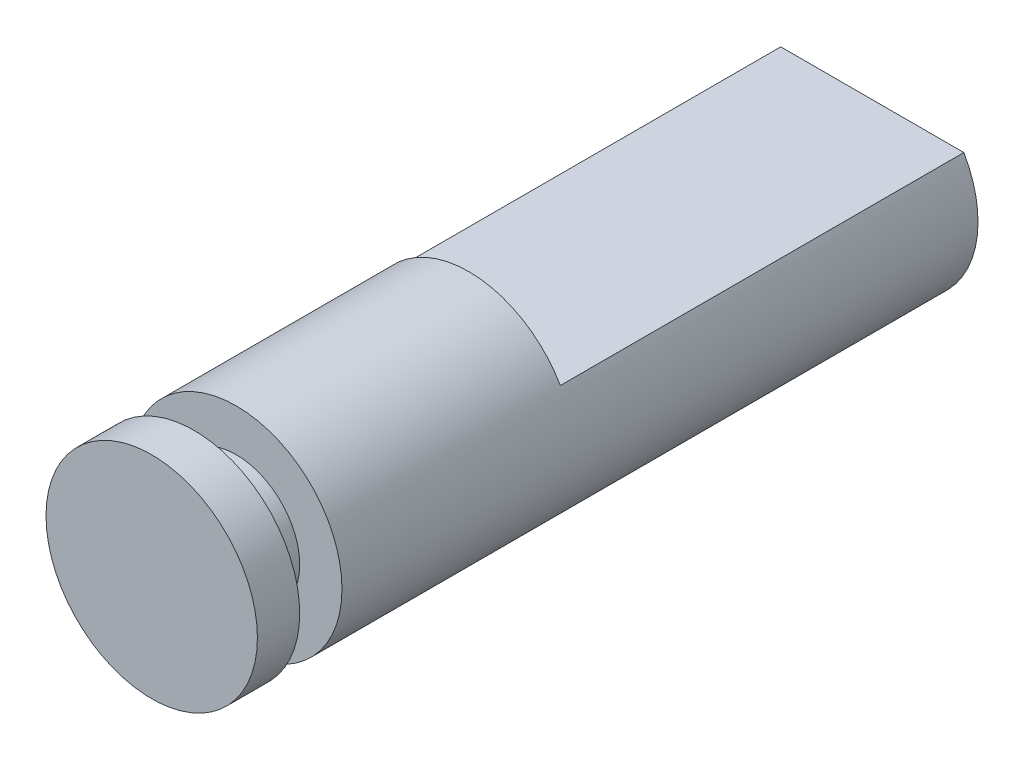
ISO-10303-21;
HEADER;
FILE_DESCRIPTION(('STEP AP214'),'2;1');
FILE_NAME('part.step','',(''),(''),'','','');
FILE_SCHEMA(('AUTOMOTIVE_DESIGN { 1 0 10303 214 1 1 1 1 }'));
ENDSEC;
DATA;
#1=APPLICATION_CONTEXT('core data for automotive mechanical design processes');
#2=APPLICATION_PROTOCOL_DEFINITION('international standard','automotive_design',2000,#1);
#3=PRODUCT_CONTEXT('',#1,'mechanical');
#4=PRODUCT('Part','Part','',(#3));
#5=PRODUCT_RELATED_PRODUCT_CATEGORY('part','',(#4));
#6=PRODUCT_DEFINITION_FORMATION('','',#4);
#7=PRODUCT_DEFINITION_CONTEXT('part definition',#1,'design');
#8=PRODUCT_DEFINITION('design','',#6,#7);
#9=PRODUCT_DEFINITION_SHAPE('','',#8);
#10=(LENGTH_UNIT() NAMED_UNIT(*) SI_UNIT(.MILLI.,.METRE.));
#11=(NAMED_UNIT(*) PLANE_ANGLE_UNIT() SI_UNIT($,.RADIAN.));
#12=(NAMED_UNIT(*) SI_UNIT($,.STERADIAN.) SOLID_ANGLE_UNIT());
#13=UNCERTAINTY_MEASURE_WITH_UNIT(LENGTH_MEASURE(1.E-05),#10,'distance_accuracy_value','');
#14=(GEOMETRIC_REPRESENTATION_CONTEXT(3) GLOBAL_UNCERTAINTY_ASSIGNED_CONTEXT((#13)) GLOBAL_UNIT_ASSIGNED_CONTEXT((#10,
#11,#12)) REPRESENTATION_CONTEXT('',''));
#15=CARTESIAN_POINT('',(0.,0.,0.));
#16=DIRECTION('',(0.,0.,1.));
#17=DIRECTION('',(1.,0.,0.));
#18=AXIS2_PLACEMENT_3D('',#15,#16,#17);
#19=CARTESIAN_POINT('',(0.,0.,19.0848469));
#20=DIRECTION('',(0.,0.,-1.));
#21=DIRECTION('',(-1.,0.,0.));
#22=AXIS2_PLACEMENT_3D('',#19,#20,#21);
#23=CYLINDRICAL_SURFACE('',#22,5.);
#24=CARTESIAN_POINT('',(0.,0.,0.));
#25=DIRECTION('',(0.,0.,1.));
#26=DIRECTION('',(1.,0.,0.));
#27=AXIS2_PLACEMENT_3D('',#24,#25,#26);
#28=CIRCLE('',#27,5.);
#29=CARTESIAN_POINT('',(-4.33012701892219,2.5,0.));
#30=VERTEX_POINT('',#29);
#31=CARTESIAN_POINT('',(4.33012701892219,2.5,0.));
#32=VERTEX_POINT('',#31);
#33=EDGE_CURVE('E72',#30,#32,#28,.T.);
#34=ORIENTED_EDGE('',*,*,#33,.T.);
#35=DIRECTION('',(0.,0.,-1.));
#36=VECTOR('',#35,1.);
#37=CARTESIAN_POINT('',(4.33012701892219,2.5,19.0848469));
#38=LINE('',#37,#36);
#39=CARTESIAN_POINT('',(4.33012701892219,2.5,19.0848469));
#40=VERTEX_POINT('',#39);
#41=EDGE_CURVE('E48',#40,#32,#38,.T.);
#42=ORIENTED_EDGE('',*,*,#41,.F.);
#43=CARTESIAN_POINT('',(0.,0.,19.0848469));
#44=DIRECTION('',(0.,0.,1.));
#45=DIRECTION('',(1.,0.,0.));
#46=AXIS2_PLACEMENT_3D('',#43,#44,#45);
#47=CIRCLE('',#46,5.);
#48=CARTESIAN_POINT('',(-4.33012701892219,2.5,19.0848469));
#49=VERTEX_POINT('',#48);
#50=EDGE_CURVE('E70',#40,#49,#47,.T.);
#51=ORIENTED_EDGE('',*,*,#50,.T.);
#52=DIRECTION('',(0.,0.,-1.));
#53=VECTOR('',#52,1.);
#54=CARTESIAN_POINT('',(-4.33012701892219,2.5,19.0848469));
#55=LINE('',#54,#53);
#56=EDGE_CURVE('E11',#49,#30,#55,.T.);
#57=ORIENTED_EDGE('',*,*,#56,.T.);
#58=EDGE_LOOP('',(#34,#42,#51,#57));
#59=FACE_BOUND('',#58,.T.);
#60=CARTESIAN_POINT('',(0.,0.,30.0848469));
#61=DIRECTION('',(0.,0.,1.));
#62=DIRECTION('',(1.,0.,0.));
#63=AXIS2_PLACEMENT_3D('',#60,#61,#62);
#64=CIRCLE('',#63,5.);
#65=CARTESIAN_POINT('',(5.,0.,30.0848469));
#66=VERTEX_POINT('',#65);
#67=EDGE_CURVE('E77',#66,#66,#64,.T.);
#68=ORIENTED_EDGE('',*,*,#67,.F.);
#69=EDGE_LOOP('',(#68));
#70=FACE_BOUND('',#69,.T.);
#71=ADVANCED_FACE('F38',(#59,#70),#23,.T.);
#72=CARTESIAN_POINT('',(0.,2.5,19.0848469));
#73=DIRECTION('',(0.,-1.,0.));
#74=DIRECTION('',(0.,0.,-1.));
#75=AXIS2_PLACEMENT_3D('',#72,#73,#74);
#76=PLANE('',#75);
#77=DIRECTION('',(-1.,0.,0.));
#78=VECTOR('',#77,1.);
#79=CARTESIAN_POINT('',(0.,2.5,0.));
#80=LINE('',#79,#78);
#81=EDGE_CURVE('E63',#32,#30,#80,.T.);
#82=ORIENTED_EDGE('',*,*,#81,.T.);
#83=ORIENTED_EDGE('',*,*,#56,.F.);
#84=DIRECTION('',(-1.,0.,0.));
#85=VECTOR('',#84,1.);
#86=CARTESIAN_POINT('',(0.,2.5,19.0848469));
#87=LINE('',#86,#85);
#88=EDGE_CURVE('E65',#40,#49,#87,.T.);
#89=ORIENTED_EDGE('',*,*,#88,.F.);
#90=ORIENTED_EDGE('',*,*,#41,.T.);
#91=EDGE_LOOP('',(#82,#83,#89,#90));
#92=FACE_BOUND('',#91,.T.);
#93=ADVANCED_FACE('F40',(#92),#76,.F.);
#94=CARTESIAN_POINT('',(0.,0.,0.));
#95=DIRECTION('',(0.,0.,1.));
#96=DIRECTION('',(1.,0.,0.));
#97=AXIS2_PLACEMENT_3D('',#94,#95,#96);
#98=PLANE('',#97);
#99=ORIENTED_EDGE('',*,*,#81,.F.);
#100=ORIENTED_EDGE('',*,*,#33,.F.);
#101=EDGE_LOOP('',(#99,#100));
#102=FACE_BOUND('',#101,.T.);
#103=ADVANCED_FACE('F93',(#102),#98,.F.);
#104=CARTESIAN_POINT('',(0.,0.,19.0848469));
#105=DIRECTION('',(0.,0.,1.));
#106=DIRECTION('',(1.,0.,0.));
#107=AXIS2_PLACEMENT_3D('',#104,#105,#106);
#108=PLANE('',#107);
#109=ORIENTED_EDGE('',*,*,#50,.F.);
#110=ORIENTED_EDGE('',*,*,#88,.T.);
#111=EDGE_LOOP('',(#109,#110));
#112=FACE_BOUND('',#111,.T.);
#113=ADVANCED_FACE('F69',(#112),#108,.F.);
#114=CARTESIAN_POINT('',(0.,0.,30.0848469));
#115=DIRECTION('',(0.,0.,1.));
#116=DIRECTION('',(1.,0.,0.));
#117=AXIS2_PLACEMENT_3D('',#114,#115,#116);
#118=PLANE('',#117);
#119=CARTESIAN_POINT('',(0.,0.,30.0848469));
#120=DIRECTION('',(0.,0.,1.));
#121=DIRECTION('',(1.,0.,0.));
#122=AXIS2_PLACEMENT_3D('',#119,#120,#121);
#123=CIRCLE('',#122,3.);
#124=CARTESIAN_POINT('',(3.,0.,30.0848469));
#125=VERTEX_POINT('',#124);
#126=EDGE_CURVE('E124',#125,#125,#123,.T.);
#127=ORIENTED_EDGE('',*,*,#126,.F.);
#128=EDGE_LOOP('',(#127));
#129=FACE_BOUND('',#128,.T.);
#130=ORIENTED_EDGE('',*,*,#67,.T.);
#131=EDGE_LOOP('',(#130));
#132=FACE_BOUND('',#131,.T.);
#133=ADVANCED_FACE('F100',(#129,#132),#118,.T.);
#134=CARTESIAN_POINT('',(0.,0.,32.0848469));
#135=DIRECTION('',(0.,0.,1.));
#136=DIRECTION('',(1.,0.,0.));
#137=AXIS2_PLACEMENT_3D('',#134,#135,#136);
#138=PLANE('',#137);
#139=CARTESIAN_POINT('',(0.,0.,32.0848469));
#140=DIRECTION('',(0.,0.,1.));
#141=DIRECTION('',(1.,0.,0.));
#142=AXIS2_PLACEMENT_3D('',#139,#140,#141);
#143=CIRCLE('',#142,3.);
#144=CARTESIAN_POINT('',(3.,0.,32.0848469));
#145=VERTEX_POINT('',#144);
#146=EDGE_CURVE('E127',#145,#145,#143,.T.);
#147=ORIENTED_EDGE('',*,*,#146,.T.);
#148=EDGE_LOOP('',(#147));
#149=FACE_BOUND('',#148,.T.);
#150=CARTESIAN_POINT('',(0.,0.,32.0848469));
#151=DIRECTION('',(0.,0.,1.));
#152=DIRECTION('',(1.,0.,0.));
#153=AXIS2_PLACEMENT_3D('',#150,#151,#152);
#154=CIRCLE('',#153,5.);
#155=CARTESIAN_POINT('',(5.,0.,32.0848469));
#156=VERTEX_POINT('',#155);
#157=EDGE_CURVE('E84',#156,#156,#154,.T.);
#158=ORIENTED_EDGE('',*,*,#157,.F.);
#159=EDGE_LOOP('',(#158));
#160=FACE_BOUND('',#159,.T.);
#161=ADVANCED_FACE('F134',(#149,#160),#138,.F.);
#162=CARTESIAN_POINT('',(0.,0.,30.0848469));
#163=DIRECTION('',(0.,0.,1.));
#164=DIRECTION('',(1.,0.,0.));
#165=AXIS2_PLACEMENT_3D('',#162,#163,#164);
#166=CYLINDRICAL_SURFACE('',#165,3.);
#167=ORIENTED_EDGE('',*,*,#126,.T.);
#168=EDGE_LOOP('',(#167));
#169=FACE_BOUND('',#168,.T.);
#170=ORIENTED_EDGE('',*,*,#146,.F.);
#171=EDGE_LOOP('',(#170));
#172=FACE_BOUND('',#171,.T.);
#173=ADVANCED_FACE('F115',(#169,#172),#166,.T.);
#174=CARTESIAN_POINT('',(0.,0.,34.0848469));
#175=DIRECTION('',(0.,0.,1.));
#176=DIRECTION('',(1.,0.,0.));
#177=AXIS2_PLACEMENT_3D('',#174,#175,#176);
#178=PLANE('',#177);
#179=CARTESIAN_POINT('',(0.,0.,34.0848469));
#180=DIRECTION('',(0.,0.,1.));
#181=DIRECTION('',(1.,0.,0.));
#182=AXIS2_PLACEMENT_3D('',#179,#180,#181);
#183=CIRCLE('',#182,5.);
#184=CARTESIAN_POINT('',(5.,0.,34.0848469));
#185=VERTEX_POINT('',#184);
#186=EDGE_CURVE('E76',#185,#185,#183,.T.);
#187=ORIENTED_EDGE('',*,*,#186,.T.);
#188=EDGE_LOOP('',(#187));
#189=FACE_BOUND('',#188,.T.);
#190=ADVANCED_FACE('F110',(#189),#178,.T.);
#191=ORIENTED_EDGE('',*,*,#157,.T.);
#192=EDGE_LOOP('',(#191));
#193=FACE_BOUND('',#192,.T.);
#194=ORIENTED_EDGE('',*,*,#186,.F.);
#195=EDGE_LOOP('',(#194));
#196=FACE_BOUND('',#195,.T.);
#197=ADVANCED_FACE('F104',(#193,#196),#23,.T.);
#198=CLOSED_SHELL('',(#71,#93,#103,#113,#133,#161,#173,#190,#197));
#199=MANIFOLD_SOLID_BREP('B2',#198);
#200=ADVANCED_BREP_SHAPE_REPRESENTATION('',(#18,#199),#14);
#201=SHAPE_DEFINITION_REPRESENTATION(#9,#200);
ENDSEC;
END-ISO-10303-21;
